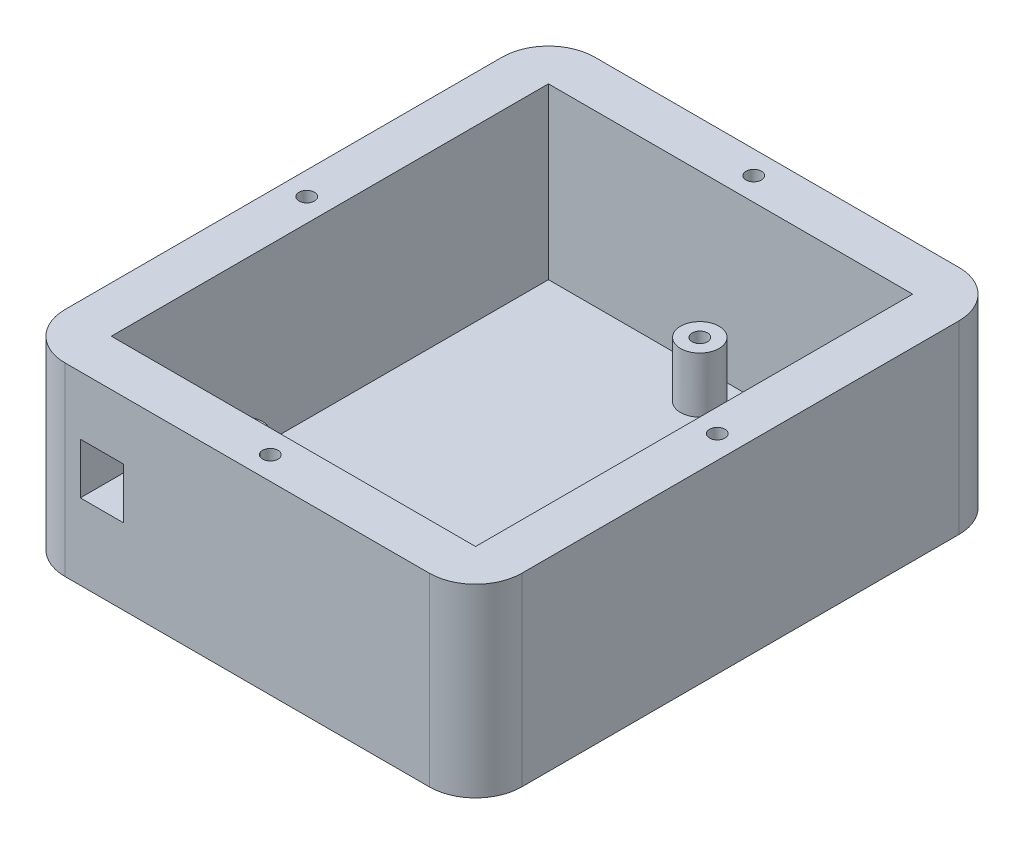
ISO-10303-21;
HEADER;
FILE_DESCRIPTION(('STEP AP214'),'2;1');
FILE_NAME('part.step','',(''),(''),'','','');
FILE_SCHEMA(('AUTOMOTIVE_DESIGN { 1 0 10303 214 1 1 1 1 }'));
ENDSEC;
DATA;
#1=APPLICATION_CONTEXT('core data for automotive mechanical design processes');
#2=APPLICATION_PROTOCOL_DEFINITION('international standard','automotive_design',2000,#1);
#3=PRODUCT_CONTEXT('',#1,'mechanical');
#4=PRODUCT('Part','Part','',(#3));
#5=PRODUCT_RELATED_PRODUCT_CATEGORY('part','',(#4));
#6=PRODUCT_DEFINITION_FORMATION('','',#4);
#7=PRODUCT_DEFINITION_CONTEXT('part definition',#1,'design');
#8=PRODUCT_DEFINITION('design','',#6,#7);
#9=PRODUCT_DEFINITION_SHAPE('','',#8);
#10=(LENGTH_UNIT() NAMED_UNIT(*) SI_UNIT(.MILLI.,.METRE.));
#11=(NAMED_UNIT(*) PLANE_ANGLE_UNIT() SI_UNIT($,.RADIAN.));
#12=(NAMED_UNIT(*) SI_UNIT($,.STERADIAN.) SOLID_ANGLE_UNIT());
#13=UNCERTAINTY_MEASURE_WITH_UNIT(LENGTH_MEASURE(1.E-05),#10,'distance_accuracy_value','');
#14=(GEOMETRIC_REPRESENTATION_CONTEXT(3) GLOBAL_UNCERTAINTY_ASSIGNED_CONTEXT((#13)) GLOBAL_UNIT_ASSIGNED_CONTEXT((#10,
#11,#12)) REPRESENTATION_CONTEXT('',''));
#15=CARTESIAN_POINT('',(0.,0.,0.));
#16=DIRECTION('',(0.,0.,1.));
#17=DIRECTION('',(1.,0.,0.));
#18=AXIS2_PLACEMENT_3D('',#15,#16,#17);
#19=CARTESIAN_POINT('',(3.175,38.1,-3.175));
#20=DIRECTION('',(0.,-1.,0.));
#21=DIRECTION('',(0.,0.,-1.));
#22=AXIS2_PLACEMENT_3D('',#19,#20,#21);
#23=PLANE('',#22);
#24=CARTESIAN_POINT('',(-1.5875,38.1,-48.175000043));
#25=DIRECTION('',(0.,1.,0.));
#26=DIRECTION('',(0.,0.,1.));
#27=AXIS2_PLACEMENT_3D('',#24,#25,#26);
#28=CIRCLE('',#27,1.5875);
#29=CARTESIAN_POINT('',(-1.5875,38.1,-46.587500043));
#30=VERTEX_POINT('',#29);
#31=EDGE_CURVE('E184',#30,#30,#28,.T.);
#32=ORIENTED_EDGE('',*,*,#31,.F.);
#33=EDGE_LOOP('',(#32));
#34=FACE_BOUND('',#33,.T.);
#35=CARTESIAN_POINT('',(40.675000057,38.1,-97.937500086));
#36=DIRECTION('',(0.,1.,0.));
#37=DIRECTION('',(0.,0.,1.));
#38=AXIS2_PLACEMENT_3D('',#35,#36,#37);
#39=CIRCLE('',#38,1.5875);
#40=CARTESIAN_POINT('',(40.675000057,38.1,-96.350000086));
#41=VERTEX_POINT('',#40);
#42=EDGE_CURVE('E190',#41,#41,#39,.T.);
#43=ORIENTED_EDGE('',*,*,#42,.F.);
#44=EDGE_LOOP('',(#43));
#45=FACE_BOUND('',#44,.T.);
#46=CARTESIAN_POINT('',(40.675000057,38.1,1.58749999999996));
#47=DIRECTION('',(0.,1.,0.));
#48=DIRECTION('',(0.,0.,-1.));
#49=AXIS2_PLACEMENT_3D('',#46,#47,#48);
#50=CIRCLE('',#49,1.5875);
#51=CARTESIAN_POINT('',(40.675000057,38.1,0.));
#52=VERTEX_POINT('',#51);
#53=EDGE_CURVE('E196',#52,#52,#50,.T.);
#54=ORIENTED_EDGE('',*,*,#53,.F.);
#55=EDGE_LOOP('',(#54));
#56=FACE_BOUND('',#55,.T.);
#57=CARTESIAN_POINT('',(82.937500114,38.1,-48.175000043));
#58=DIRECTION('',(0.,1.,0.));
#59=DIRECTION('',(0.,0.,-1.));
#60=AXIS2_PLACEMENT_3D('',#57,#58,#59);
#61=CIRCLE('',#60,1.58749999999999);
#62=CARTESIAN_POINT('',(82.937500114,38.1,-49.762500043));
#63=VERTEX_POINT('',#62);
#64=EDGE_CURVE('E178',#63,#63,#61,.T.);
#65=ORIENTED_EDGE('',*,*,#64,.F.);
#66=EDGE_LOOP('',(#65));
#67=FACE_BOUND('',#66,.T.);
#68=DIRECTION('',(0.,0.,-1.));
#69=VECTOR('',#68,1.);
#70=CARTESIAN_POINT('',(78.175000114,38.1,-3.175));
#71=LINE('',#70,#69);
#72=CARTESIAN_POINT('',(78.175000114,38.1,-3.175));
#73=VERTEX_POINT('',#72);
#74=CARTESIAN_POINT('',(78.175000114,38.1,-93.175000086));
#75=VERTEX_POINT('',#74);
#76=EDGE_CURVE('E281',#73,#75,#71,.T.);
#77=ORIENTED_EDGE('',*,*,#76,.F.);
#78=DIRECTION('',(1.,0.,0.));
#79=VECTOR('',#78,1.);
#80=CARTESIAN_POINT('',(3.175,38.1,-3.175));
#81=LINE('',#80,#79);
#82=CARTESIAN_POINT('',(3.175,38.1,-3.175));
#83=VERTEX_POINT('',#82);
#84=EDGE_CURVE('E284',#83,#73,#81,.T.);
#85=ORIENTED_EDGE('',*,*,#84,.F.);
#86=DIRECTION('',(0.,0.,1.));
#87=VECTOR('',#86,1.);
#88=CARTESIAN_POINT('',(3.175,38.1,-93.175000086));
#89=LINE('',#88,#87);
#90=CARTESIAN_POINT('',(3.175,38.1,-93.175000086));
#91=VERTEX_POINT('',#90);
#92=EDGE_CURVE('E277',#91,#83,#89,.T.);
#93=ORIENTED_EDGE('',*,*,#92,.F.);
#94=DIRECTION('',(-1.,0.,0.));
#95=VECTOR('',#94,1.);
#96=CARTESIAN_POINT('',(78.175000114,38.1,-93.175000086));
#97=LINE('',#96,#95);
#98=EDGE_CURVE('E278',#75,#91,#97,.T.);
#99=ORIENTED_EDGE('',*,*,#98,.F.);
#100=EDGE_LOOP('',(#77,#85,#93,#99));
#101=FACE_BOUND('',#100,.T.);
#102=CARTESIAN_POINT('',(3.175,38.1,-3.175));
#103=DIRECTION('',(0.,-1.,0.));
#104=DIRECTION('',(0.,0.,-1.));
#105=AXIS2_PLACEMENT_3D('',#102,#103,#104);
#106=CIRCLE('',#105,9.525);
#107=CARTESIAN_POINT('',(-6.35,38.1,-3.17500000000007));
#108=VERTEX_POINT('',#107);
#109=CARTESIAN_POINT('',(3.17500000000007,38.1,6.35));
#110=VERTEX_POINT('',#109);
#111=EDGE_CURVE('E207',#108,#110,#106,.F.);
#112=ORIENTED_EDGE('',*,*,#111,.T.);
#113=DIRECTION('',(1.,0.,0.));
#114=VECTOR('',#113,1.);
#115=CARTESIAN_POINT('',(78.175000114,38.1,6.35));
#116=LINE('',#115,#114);
#117=CARTESIAN_POINT('',(78.175000114,38.1,6.35));
#118=VERTEX_POINT('',#117);
#119=EDGE_CURVE('E219',#110,#118,#116,.T.);
#120=ORIENTED_EDGE('',*,*,#119,.T.);
#121=CARTESIAN_POINT('',(78.175000114,38.1,-3.175));
#122=DIRECTION('',(0.,-1.,0.));
#123=DIRECTION('',(0.,0.,-1.));
#124=AXIS2_PLACEMENT_3D('',#121,#122,#123);
#125=CIRCLE('',#124,9.525);
#126=CARTESIAN_POINT('',(87.700000114,38.1,-3.175));
#127=VERTEX_POINT('',#126);
#128=EDGE_CURVE('E217',#118,#127,#125,.F.);
#129=ORIENTED_EDGE('',*,*,#128,.T.);
#130=DIRECTION('',(0.,0.,-1.));
#131=VECTOR('',#130,1.);
#132=CARTESIAN_POINT('',(87.700000114,38.1,-93.175000086));
#133=LINE('',#132,#131);
#134=CARTESIAN_POINT('',(87.700000114,38.1,-93.175000086));
#135=VERTEX_POINT('',#134);
#136=EDGE_CURVE('E215',#127,#135,#133,.T.);
#137=ORIENTED_EDGE('',*,*,#136,.T.);
#138=CARTESIAN_POINT('',(78.175000114,38.1,-93.175000086));
#139=DIRECTION('',(0.,-1.,0.));
#140=DIRECTION('',(0.,0.,-1.));
#141=AXIS2_PLACEMENT_3D('',#138,#139,#140);
#142=CIRCLE('',#141,9.52499999999999);
#143=CARTESIAN_POINT('',(78.175000114,38.1,-102.700000086));
#144=VERTEX_POINT('',#143);
#145=EDGE_CURVE('E213',#135,#144,#142,.F.);
#146=ORIENTED_EDGE('',*,*,#145,.T.);
#147=DIRECTION('',(-1.,0.,0.));
#148=VECTOR('',#147,1.);
#149=CARTESIAN_POINT('',(3.17500000000007,38.1,-102.700000086));
#150=LINE('',#149,#148);
#151=CARTESIAN_POINT('',(3.175,38.1,-102.700000086));
#152=VERTEX_POINT('',#151);
#153=EDGE_CURVE('E210',#144,#152,#150,.T.);
#154=ORIENTED_EDGE('',*,*,#153,.T.);
#155=CARTESIAN_POINT('',(3.175,38.1,-93.175000086));
#156=DIRECTION('',(0.,-1.,0.));
#157=DIRECTION('',(0.,0.,-1.));
#158=AXIS2_PLACEMENT_3D('',#155,#156,#157);
#159=CIRCLE('',#158,9.525);
#160=CARTESIAN_POINT('',(-6.35,38.1,-93.175000086));
#161=VERTEX_POINT('',#160);
#162=EDGE_CURVE('E208',#152,#161,#159,.F.);
#163=ORIENTED_EDGE('',*,*,#162,.T.);
#164=DIRECTION('',(0.,0.,1.));
#165=VECTOR('',#164,1.);
#166=CARTESIAN_POINT('',(-6.35,38.1,-3.17500000000007));
#167=LINE('',#166,#165);
#168=EDGE_CURVE('E204',#161,#108,#167,.T.);
#169=ORIENTED_EDGE('',*,*,#168,.T.);
#170=EDGE_LOOP('',(#112,#120,#129,#137,#146,#154,#163,#169));
#171=FACE_BOUND('',#170,.T.);
#172=ADVANCED_FACE('F35',(#34,#45,#56,#67,#101,#171),#23,.F.);
#173=CARTESIAN_POINT('',(3.175,3.175,-3.175));
#174=DIRECTION('',(0.,-1.,0.));
#175=DIRECTION('',(0.,0.,-1.));
#176=AXIS2_PLACEMENT_3D('',#173,#174,#175);
#177=PLANE('',#176);
#178=CARTESIAN_POINT('',(10.465000057,3.175,-23.050000043));
#179=DIRECTION('',(0.,-1.,0.));
#180=DIRECTION('',(0.,0.,-1.));
#181=AXIS2_PLACEMENT_3D('',#178,#179,#180);
#182=CIRCLE('',#181,3.96875);
#183=CARTESIAN_POINT('',(10.465000057,3.175,-27.018750043));
#184=VERTEX_POINT('',#183);
#185=EDGE_CURVE('E12',#184,#184,#182,.F.);
#186=ORIENTED_EDGE('',*,*,#185,.F.);
#187=EDGE_LOOP('',(#186));
#188=FACE_BOUND('',#187,.T.);
#189=CARTESIAN_POINT('',(40.465000057,3.175,-87.050000043));
#190=DIRECTION('',(0.,-1.,0.));
#191=DIRECTION('',(0.,0.,-1.));
#192=AXIS2_PLACEMENT_3D('',#189,#190,#191);
#193=CIRCLE('',#192,3.96874999999998);
#194=CARTESIAN_POINT('',(40.465000057,3.175,-91.018750043));
#195=VERTEX_POINT('',#194);
#196=EDGE_CURVE('E43',#195,#195,#193,.F.);
#197=ORIENTED_EDGE('',*,*,#196,.F.);
#198=EDGE_LOOP('',(#197));
#199=FACE_BOUND('',#198,.T.);
#200=DIRECTION('',(0.,0.,1.));
#201=VECTOR('',#200,1.);
#202=CARTESIAN_POINT('',(3.175,3.175,-93.175000086));
#203=LINE('',#202,#201);
#204=CARTESIAN_POINT('',(3.175,3.175,-93.175000086));
#205=VERTEX_POINT('',#204);
#206=CARTESIAN_POINT('',(3.175,3.175,-3.175));
#207=VERTEX_POINT('',#206);
#208=EDGE_CURVE('E292',#205,#207,#203,.T.);
#209=ORIENTED_EDGE('',*,*,#208,.T.);
#210=DIRECTION('',(1.,0.,0.));
#211=VECTOR('',#210,1.);
#212=CARTESIAN_POINT('',(3.175,3.175,-3.175));
#213=LINE('',#212,#211);
#214=CARTESIAN_POINT('',(78.175000114,3.175,-3.175));
#215=VERTEX_POINT('',#214);
#216=EDGE_CURVE('E280',#207,#215,#213,.T.);
#217=ORIENTED_EDGE('',*,*,#216,.T.);
#218=DIRECTION('',(0.,0.,-1.));
#219=VECTOR('',#218,1.);
#220=CARTESIAN_POINT('',(78.175000114,3.175,-3.175));
#221=LINE('',#220,#219);
#222=CARTESIAN_POINT('',(78.175000114,3.175,-93.175000086));
#223=VERTEX_POINT('',#222);
#224=EDGE_CURVE('E301',#215,#223,#221,.T.);
#225=ORIENTED_EDGE('',*,*,#224,.T.);
#226=DIRECTION('',(-1.,0.,0.));
#227=VECTOR('',#226,1.);
#228=CARTESIAN_POINT('',(78.175000114,3.175,-93.175000086));
#229=LINE('',#228,#227);
#230=EDGE_CURVE('E297',#223,#205,#229,.T.);
#231=ORIENTED_EDGE('',*,*,#230,.T.);
#232=EDGE_LOOP('',(#209,#217,#225,#231));
#233=FACE_BOUND('',#232,.T.);
#234=ADVANCED_FACE('F313',(#188,#199,#233),#177,.F.);
#235=CARTESIAN_POINT('',(3.175,-117.153745277648,-3.175));
#236=DIRECTION('',(0.,0.,1.));
#237=DIRECTION('',(1.,0.,0.));
#238=AXIS2_PLACEMENT_3D('',#235,#236,#237);
#239=PLANE('',#238);
#240=DIRECTION('',(1.,0.,0.));
#241=VECTOR('',#240,1.);
#242=CARTESIAN_POINT('',(6.32000005699999,26.0825,-3.175));
#243=LINE('',#242,#241);
#244=CARTESIAN_POINT('',(6.32000005699999,26.0825,-3.175));
#245=VERTEX_POINT('',#244);
#246=CARTESIAN_POINT('',(15.210000057,26.0825,-3.175));
#247=VERTEX_POINT('',#246);
#248=EDGE_CURVE('E426',#245,#247,#243,.T.);
#249=ORIENTED_EDGE('',*,*,#248,.F.);
#250=DIRECTION('',(0.,1.,0.));
#251=VECTOR('',#250,1.);
#252=CARTESIAN_POINT('',(6.32000005699999,26.0825,-3.175));
#253=LINE('',#252,#251);
#254=CARTESIAN_POINT('',(6.320000057,15.605,-3.175));
#255=VERTEX_POINT('',#254);
#256=EDGE_CURVE('E179',#255,#245,#253,.T.);
#257=ORIENTED_EDGE('',*,*,#256,.F.);
#258=DIRECTION('',(-1.,0.,0.));
#259=VECTOR('',#258,1.);
#260=CARTESIAN_POINT('',(6.320000057,15.605,-3.175));
#261=LINE('',#260,#259);
#262=CARTESIAN_POINT('',(15.210000057,15.605,-3.175));
#263=VERTEX_POINT('',#262);
#264=EDGE_CURVE('E176',#263,#255,#261,.T.);
#265=ORIENTED_EDGE('',*,*,#264,.F.);
#266=DIRECTION('',(0.,-1.,0.));
#267=VECTOR('',#266,1.);
#268=CARTESIAN_POINT('',(15.210000057,26.0825,-3.175));
#269=LINE('',#268,#267);
#270=EDGE_CURVE('E154',#247,#263,#269,.T.);
#271=ORIENTED_EDGE('',*,*,#270,.F.);
#272=EDGE_LOOP('',(#249,#257,#265,#271));
#273=FACE_BOUND('',#272,.T.);
#274=DIRECTION('',(0.,1.,0.));
#275=VECTOR('',#274,1.);
#276=CARTESIAN_POINT('',(3.175,-117.153745277648,-3.175));
#277=LINE('',#276,#275);
#278=EDGE_CURVE('E295',#207,#83,#277,.T.);
#279=ORIENTED_EDGE('',*,*,#278,.T.);
#280=ORIENTED_EDGE('',*,*,#84,.T.);
#281=DIRECTION('',(0.,1.,0.));
#282=VECTOR('',#281,1.);
#283=CARTESIAN_POINT('',(78.175000114,-117.153745277648,-3.175));
#284=LINE('',#283,#282);
#285=EDGE_CURVE('E291',#215,#73,#284,.T.);
#286=ORIENTED_EDGE('',*,*,#285,.F.);
#287=ORIENTED_EDGE('',*,*,#216,.F.);
#288=EDGE_LOOP('',(#279,#280,#286,#287));
#289=FACE_BOUND('',#288,.T.);
#290=ADVANCED_FACE('F316',(#273,#289),#239,.F.);
#291=CARTESIAN_POINT('',(78.175000114,-117.153745277648,-3.175));
#292=DIRECTION('',(1.,0.,0.));
#293=DIRECTION('',(0.,0.,-1.));
#294=AXIS2_PLACEMENT_3D('',#291,#292,#293);
#295=PLANE('',#294);
#296=ORIENTED_EDGE('',*,*,#285,.T.);
#297=ORIENTED_EDGE('',*,*,#76,.T.);
#298=DIRECTION('',(0.,1.,0.));
#299=VECTOR('',#298,1.);
#300=CARTESIAN_POINT('',(78.175000114,-117.153745277648,-93.175000086));
#301=LINE('',#300,#299);
#302=EDGE_CURVE('E300',#223,#75,#301,.T.);
#303=ORIENTED_EDGE('',*,*,#302,.F.);
#304=ORIENTED_EDGE('',*,*,#224,.F.);
#305=EDGE_LOOP('',(#296,#297,#303,#304));
#306=FACE_BOUND('',#305,.T.);
#307=ADVANCED_FACE('F331',(#306),#295,.F.);
#308=CARTESIAN_POINT('',(78.175000114,-117.153745277648,-93.175000086));
#309=DIRECTION('',(0.,0.,-1.));
#310=DIRECTION('',(-1.,0.,0.));
#311=AXIS2_PLACEMENT_3D('',#308,#309,#310);
#312=PLANE('',#311);
#313=ORIENTED_EDGE('',*,*,#302,.T.);
#314=ORIENTED_EDGE('',*,*,#98,.T.);
#315=DIRECTION('',(0.,1.,0.));
#316=VECTOR('',#315,1.);
#317=CARTESIAN_POINT('',(3.175,-117.153745277648,-93.175000086));
#318=LINE('',#317,#316);
#319=EDGE_CURVE('E296',#205,#91,#318,.T.);
#320=ORIENTED_EDGE('',*,*,#319,.F.);
#321=ORIENTED_EDGE('',*,*,#230,.F.);
#322=EDGE_LOOP('',(#313,#314,#320,#321));
#323=FACE_BOUND('',#322,.T.);
#324=ADVANCED_FACE('F335',(#323),#312,.F.);
#325=CARTESIAN_POINT('',(3.175,-117.153745277648,-93.175000086));
#326=DIRECTION('',(-1.,0.,0.));
#327=DIRECTION('',(0.,0.,1.));
#328=AXIS2_PLACEMENT_3D('',#325,#326,#327);
#329=PLANE('',#328);
#330=ORIENTED_EDGE('',*,*,#319,.T.);
#331=ORIENTED_EDGE('',*,*,#92,.T.);
#332=ORIENTED_EDGE('',*,*,#278,.F.);
#333=ORIENTED_EDGE('',*,*,#208,.F.);
#334=EDGE_LOOP('',(#330,#331,#332,#333));
#335=FACE_BOUND('',#334,.T.);
#336=ADVANCED_FACE('F324',(#335),#329,.F.);
#337=CARTESIAN_POINT('',(40.465000057,14.605,-87.050000043));
#338=DIRECTION('',(0.,1.,0.));
#339=DIRECTION('',(0.,0.,1.));
#340=AXIS2_PLACEMENT_3D('',#337,#338,#339);
#341=PLANE('',#340);
#342=CARTESIAN_POINT('',(40.465000057,14.605,-87.050000043));
#343=DIRECTION('',(0.,1.,0.));
#344=DIRECTION('',(0.,0.,1.));
#345=AXIS2_PLACEMENT_3D('',#342,#343,#344);
#346=CIRCLE('',#345,3.96874999999998);
#347=CARTESIAN_POINT('',(40.465000057,14.605,-83.081250043));
#348=VERTEX_POINT('',#347);
#349=EDGE_CURVE('E272',#348,#348,#346,.T.);
#350=ORIENTED_EDGE('',*,*,#349,.T.);
#351=EDGE_LOOP('',(#350));
#352=FACE_BOUND('',#351,.T.);
#353=CARTESIAN_POINT('',(40.465000057,14.605,-87.050000043));
#354=DIRECTION('',(0.,1.,0.));
#355=DIRECTION('',(0.,0.,1.));
#356=AXIS2_PLACEMENT_3D('',#353,#354,#355);
#357=CIRCLE('',#356,1.5875);
#358=CARTESIAN_POINT('',(40.465000057,14.605,-85.462500043));
#359=VERTEX_POINT('',#358);
#360=EDGE_CURVE('E269',#359,#359,#357,.T.);
#361=ORIENTED_EDGE('',*,*,#360,.F.);
#362=EDGE_LOOP('',(#361));
#363=FACE_BOUND('',#362,.T.);
#364=ADVANCED_FACE('F407',(#352,#363),#341,.T.);
#365=CARTESIAN_POINT('',(40.465000057,14.605,-87.050000043));
#366=DIRECTION('',(0.,-1.,0.));
#367=DIRECTION('',(0.,0.,-1.));
#368=AXIS2_PLACEMENT_3D('',#365,#366,#367);
#369=CYLINDRICAL_SURFACE('',#368,3.96874999999998);
#370=ORIENTED_EDGE('',*,*,#349,.F.);
#371=EDGE_LOOP('',(#370));
#372=FACE_BOUND('',#371,.T.);
#373=ORIENTED_EDGE('',*,*,#196,.T.);
#374=EDGE_LOOP('',(#373));
#375=FACE_BOUND('',#374,.T.);
#376=ADVANCED_FACE('F311',(#372,#375),#369,.T.);
#377=CARTESIAN_POINT('',(40.465000057,14.605,-87.050000043));
#378=DIRECTION('',(0.,-1.,0.));
#379=DIRECTION('',(0.,0.,-1.));
#380=AXIS2_PLACEMENT_3D('',#377,#378,#379);
#381=CYLINDRICAL_SURFACE('',#380,1.5875);
#382=ORIENTED_EDGE('',*,*,#360,.T.);
#383=EDGE_LOOP('',(#382));
#384=FACE_BOUND('',#383,.T.);
#385=CARTESIAN_POINT('',(40.465000057,3.175,-87.050000043));
#386=DIRECTION('',(0.,1.,0.));
#387=DIRECTION('',(0.,0.,1.));
#388=AXIS2_PLACEMENT_3D('',#385,#386,#387);
#389=CIRCLE('',#388,1.5875);
#390=CARTESIAN_POINT('',(40.465000057,3.175,-85.462500043));
#391=VERTEX_POINT('',#390);
#392=EDGE_CURVE('E268',#391,#391,#389,.T.);
#393=ORIENTED_EDGE('',*,*,#392,.F.);
#394=EDGE_LOOP('',(#393));
#395=FACE_BOUND('',#394,.T.);
#396=ADVANCED_FACE('F403',(#384,#395),#381,.F.);
#397=ORIENTED_EDGE('',*,*,#392,.T.);
#398=EDGE_LOOP('',(#397));
#399=FACE_BOUND('',#398,.T.);
#400=ADVANCED_FACE('F320',(#399),#177,.F.);
#401=CARTESIAN_POINT('',(10.465000057,14.605,-23.050000043));
#402=DIRECTION('',(0.,1.,0.));
#403=DIRECTION('',(0.,0.,1.));
#404=AXIS2_PLACEMENT_3D('',#401,#402,#403);
#405=PLANE('',#404);
#406=CARTESIAN_POINT('',(10.465000057,14.605,-23.050000043));
#407=DIRECTION('',(0.,1.,0.));
#408=DIRECTION('',(0.,0.,1.));
#409=AXIS2_PLACEMENT_3D('',#406,#407,#408);
#410=CIRCLE('',#409,3.96875);
#411=CARTESIAN_POINT('',(10.465000057,14.605,-19.081250043));
#412=VERTEX_POINT('',#411);
#413=EDGE_CURVE('E263',#412,#412,#410,.T.);
#414=ORIENTED_EDGE('',*,*,#413,.T.);
#415=EDGE_LOOP('',(#414));
#416=FACE_BOUND('',#415,.T.);
#417=CARTESIAN_POINT('',(10.465000057,14.605,-23.050000043));
#418=DIRECTION('',(0.,1.,0.));
#419=DIRECTION('',(0.,0.,1.));
#420=AXIS2_PLACEMENT_3D('',#417,#418,#419);
#421=CIRCLE('',#420,1.5875);
#422=CARTESIAN_POINT('',(10.465000057,14.605,-21.462500043));
#423=VERTEX_POINT('',#422);
#424=EDGE_CURVE('E260',#423,#423,#421,.T.);
#425=ORIENTED_EDGE('',*,*,#424,.F.);
#426=EDGE_LOOP('',(#425));
#427=FACE_BOUND('',#426,.T.);
#428=ADVANCED_FACE('F396',(#416,#427),#405,.T.);
#429=CARTESIAN_POINT('',(10.465000057,14.605,-23.050000043));
#430=DIRECTION('',(0.,-1.,0.));
#431=DIRECTION('',(0.,0.,-1.));
#432=AXIS2_PLACEMENT_3D('',#429,#430,#431);
#433=CYLINDRICAL_SURFACE('',#432,3.96875);
#434=ORIENTED_EDGE('',*,*,#413,.F.);
#435=EDGE_LOOP('',(#434));
#436=FACE_BOUND('',#435,.T.);
#437=ORIENTED_EDGE('',*,*,#185,.T.);
#438=EDGE_LOOP('',(#437));
#439=FACE_BOUND('',#438,.T.);
#440=ADVANCED_FACE('F394',(#436,#439),#433,.T.);
#441=CARTESIAN_POINT('',(10.465000057,14.605,-23.050000043));
#442=DIRECTION('',(0.,-1.,0.));
#443=DIRECTION('',(0.,0.,-1.));
#444=AXIS2_PLACEMENT_3D('',#441,#442,#443);
#445=CYLINDRICAL_SURFACE('',#444,1.5875);
#446=ORIENTED_EDGE('',*,*,#424,.T.);
#447=EDGE_LOOP('',(#446));
#448=FACE_BOUND('',#447,.T.);
#449=CARTESIAN_POINT('',(10.465000057,3.175,-23.050000043));
#450=DIRECTION('',(0.,1.,0.));
#451=DIRECTION('',(0.,0.,1.));
#452=AXIS2_PLACEMENT_3D('',#449,#450,#451);
#453=CIRCLE('',#452,1.5875);
#454=CARTESIAN_POINT('',(10.465000057,3.175,-21.462500043));
#455=VERTEX_POINT('',#454);
#456=EDGE_CURVE('E206',#455,#455,#453,.T.);
#457=ORIENTED_EDGE('',*,*,#456,.F.);
#458=EDGE_LOOP('',(#457));
#459=FACE_BOUND('',#458,.T.);
#460=ADVANCED_FACE('F386',(#448,#459),#445,.F.);
#461=ORIENTED_EDGE('',*,*,#456,.T.);
#462=EDGE_LOOP('',(#461));
#463=FACE_BOUND('',#462,.T.);
#464=ADVANCED_FACE('F319',(#463),#177,.F.);
#465=CARTESIAN_POINT('',(-6.35,182.104531318289,-3.17500000000007));
#466=DIRECTION('',(-1.,0.,0.));
#467=DIRECTION('',(0.,0.,1.));
#468=AXIS2_PLACEMENT_3D('',#465,#466,#467);
#469=PLANE('',#468);
#470=ORIENTED_EDGE('',*,*,#168,.F.);
#471=DIRECTION('',(0.,-1.,0.));
#472=VECTOR('',#471,1.);
#473=CARTESIAN_POINT('',(-6.35,182.104531318289,-93.175000086));
#474=LINE('',#473,#472);
#475=CARTESIAN_POINT('',(-6.35,0.,-93.175000086));
#476=VERTEX_POINT('',#475);
#477=EDGE_CURVE('E257',#161,#476,#474,.T.);
#478=ORIENTED_EDGE('',*,*,#477,.T.);
#479=DIRECTION('',(0.,0.,-1.));
#480=VECTOR('',#479,1.);
#481=CARTESIAN_POINT('',(-6.35,0.,-3.17500000000007));
#482=LINE('',#481,#480);
#483=CARTESIAN_POINT('',(-6.35,0.,-3.17500000000007));
#484=VERTEX_POINT('',#483);
#485=EDGE_CURVE('E224',#484,#476,#482,.T.);
#486=ORIENTED_EDGE('',*,*,#485,.F.);
#487=DIRECTION('',(0.,-1.,0.));
#488=VECTOR('',#487,1.);
#489=CARTESIAN_POINT('',(-6.35,182.104531318289,-3.17500000000007));
#490=LINE('',#489,#488);
#491=EDGE_CURVE('E245',#108,#484,#490,.T.);
#492=ORIENTED_EDGE('',*,*,#491,.F.);
#493=EDGE_LOOP('',(#470,#478,#486,#492));
#494=FACE_BOUND('',#493,.T.);
#495=ADVANCED_FACE('F378',(#494),#469,.T.);
#496=CARTESIAN_POINT('',(3.175,182.104531318289,-93.175000086));
#497=DIRECTION('',(0.,-1.,0.));
#498=DIRECTION('',(0.,0.,-1.));
#499=AXIS2_PLACEMENT_3D('',#496,#497,#498);
#500=CYLINDRICAL_SURFACE('',#499,9.525);
#501=ORIENTED_EDGE('',*,*,#162,.F.);
#502=DIRECTION('',(0.,-1.,0.));
#503=VECTOR('',#502,1.);
#504=CARTESIAN_POINT('',(3.17500000000007,182.104531318289,-102.700000086));
#505=LINE('',#504,#503);
#506=CARTESIAN_POINT('',(3.17500000000007,0.,-102.700000086));
#507=VERTEX_POINT('',#506);
#508=EDGE_CURVE('E255',#152,#507,#505,.T.);
#509=ORIENTED_EDGE('',*,*,#508,.T.);
#510=CARTESIAN_POINT('',(3.175,0.,-93.175000086));
#511=DIRECTION('',(0.,-1.,0.));
#512=DIRECTION('',(0.,0.,-1.));
#513=AXIS2_PLACEMENT_3D('',#510,#511,#512);
#514=CIRCLE('',#513,9.525);
#515=EDGE_CURVE('E227',#476,#507,#514,.T.);
#516=ORIENTED_EDGE('',*,*,#515,.F.);
#517=ORIENTED_EDGE('',*,*,#477,.F.);
#518=EDGE_LOOP('',(#501,#509,#516,#517));
#519=FACE_BOUND('',#518,.T.);
#520=ADVANCED_FACE('F375',(#519),#500,.T.);
#521=CARTESIAN_POINT('',(3.17500000000007,182.104531318289,-102.700000086));
#522=DIRECTION('',(0.,0.,-1.));
#523=DIRECTION('',(-1.,0.,0.));
#524=AXIS2_PLACEMENT_3D('',#521,#522,#523);
#525=PLANE('',#524);
#526=ORIENTED_EDGE('',*,*,#153,.F.);
#527=DIRECTION('',(0.,-1.,0.));
#528=VECTOR('',#527,1.);
#529=CARTESIAN_POINT('',(78.175000114,182.104531318289,-102.700000086));
#530=LINE('',#529,#528);
#531=CARTESIAN_POINT('',(78.175000114,0.,-102.700000086));
#532=VERTEX_POINT('',#531);
#533=EDGE_CURVE('E253',#144,#532,#530,.T.);
#534=ORIENTED_EDGE('',*,*,#533,.T.);
#535=DIRECTION('',(1.,0.,0.));
#536=VECTOR('',#535,1.);
#537=CARTESIAN_POINT('',(3.17500000000007,0.,-102.700000086));
#538=LINE('',#537,#536);
#539=EDGE_CURVE('E230',#507,#532,#538,.T.);
#540=ORIENTED_EDGE('',*,*,#539,.F.);
#541=ORIENTED_EDGE('',*,*,#508,.F.);
#542=EDGE_LOOP('',(#526,#534,#540,#541));
#543=FACE_BOUND('',#542,.T.);
#544=ADVANCED_FACE('F371',(#543),#525,.T.);
#545=CARTESIAN_POINT('',(78.175000114,182.104531318289,-93.175000086));
#546=DIRECTION('',(0.,-1.,0.));
#547=DIRECTION('',(0.,0.,-1.));
#548=AXIS2_PLACEMENT_3D('',#545,#546,#547);
#549=CYLINDRICAL_SURFACE('',#548,9.52499999999999);
#550=ORIENTED_EDGE('',*,*,#145,.F.);
#551=DIRECTION('',(0.,-1.,0.));
#552=VECTOR('',#551,1.);
#553=CARTESIAN_POINT('',(87.700000114,182.104531318289,-93.175000086));
#554=LINE('',#553,#552);
#555=CARTESIAN_POINT('',(87.700000114,0.,-93.175000086));
#556=VERTEX_POINT('',#555);
#557=EDGE_CURVE('E251',#135,#556,#554,.T.);
#558=ORIENTED_EDGE('',*,*,#557,.T.);
#559=CARTESIAN_POINT('',(78.175000114,0.,-93.175000086));
#560=DIRECTION('',(0.,-1.,0.));
#561=DIRECTION('',(0.,0.,-1.));
#562=AXIS2_PLACEMENT_3D('',#559,#560,#561);
#563=CIRCLE('',#562,9.52499999999999);
#564=EDGE_CURVE('E233',#532,#556,#563,.T.);
#565=ORIENTED_EDGE('',*,*,#564,.F.);
#566=ORIENTED_EDGE('',*,*,#533,.F.);
#567=EDGE_LOOP('',(#550,#558,#565,#566));
#568=FACE_BOUND('',#567,.T.);
#569=ADVANCED_FACE('F365',(#568),#549,.T.);
#570=CARTESIAN_POINT('',(87.700000114,182.104531318289,-93.175000086));
#571=DIRECTION('',(1.,0.,0.));
#572=DIRECTION('',(0.,0.,-1.));
#573=AXIS2_PLACEMENT_3D('',#570,#571,#572);
#574=PLANE('',#573);
#575=ORIENTED_EDGE('',*,*,#136,.F.);
#576=DIRECTION('',(0.,-1.,0.));
#577=VECTOR('',#576,1.);
#578=CARTESIAN_POINT('',(87.700000114,182.104531318289,-3.175));
#579=LINE('',#578,#577);
#580=CARTESIAN_POINT('',(87.700000114,0.,-3.175));
#581=VERTEX_POINT('',#580);
#582=EDGE_CURVE('E249',#127,#581,#579,.T.);
#583=ORIENTED_EDGE('',*,*,#582,.T.);
#584=DIRECTION('',(0.,0.,1.));
#585=VECTOR('',#584,1.);
#586=CARTESIAN_POINT('',(87.700000114,0.,-93.175000086));
#587=LINE('',#586,#585);
#588=EDGE_CURVE('E236',#556,#581,#587,.T.);
#589=ORIENTED_EDGE('',*,*,#588,.F.);
#590=ORIENTED_EDGE('',*,*,#557,.F.);
#591=EDGE_LOOP('',(#575,#583,#589,#590));
#592=FACE_BOUND('',#591,.T.);
#593=ADVANCED_FACE('F362',(#592),#574,.T.);
#594=CARTESIAN_POINT('',(78.175000114,182.104531318289,-3.175));
#595=DIRECTION('',(0.,-1.,0.));
#596=DIRECTION('',(0.,0.,-1.));
#597=AXIS2_PLACEMENT_3D('',#594,#595,#596);
#598=CYLINDRICAL_SURFACE('',#597,9.525);
#599=ORIENTED_EDGE('',*,*,#128,.F.);
#600=DIRECTION('',(0.,-1.,0.));
#601=VECTOR('',#600,1.);
#602=CARTESIAN_POINT('',(78.175000114,182.104531318289,6.35));
#603=LINE('',#602,#601);
#604=CARTESIAN_POINT('',(78.175000114,0.,6.35));
#605=VERTEX_POINT('',#604);
#606=EDGE_CURVE('E247',#118,#605,#603,.T.);
#607=ORIENTED_EDGE('',*,*,#606,.T.);
#608=CARTESIAN_POINT('',(78.175000114,0.,-3.175));
#609=DIRECTION('',(0.,-1.,0.));
#610=DIRECTION('',(0.,0.,-1.));
#611=AXIS2_PLACEMENT_3D('',#608,#609,#610);
#612=CIRCLE('',#611,9.525);
#613=EDGE_CURVE('E239',#581,#605,#612,.T.);
#614=ORIENTED_EDGE('',*,*,#613,.F.);
#615=ORIENTED_EDGE('',*,*,#582,.F.);
#616=EDGE_LOOP('',(#599,#607,#614,#615));
#617=FACE_BOUND('',#616,.T.);
#618=ADVANCED_FACE('F357',(#617),#598,.T.);
#619=CARTESIAN_POINT('',(78.175000114,182.104531318289,6.35));
#620=DIRECTION('',(0.,0.,1.));
#621=DIRECTION('',(1.,0.,0.));
#622=AXIS2_PLACEMENT_3D('',#619,#620,#621);
#623=PLANE('',#622);
#624=DIRECTION('',(0.,-1.,0.));
#625=VECTOR('',#624,1.);
#626=CARTESIAN_POINT('',(6.32000005699999,26.0825,6.35));
#627=LINE('',#626,#625);
#628=CARTESIAN_POINT('',(6.32000005699999,26.0825,6.35));
#629=VERTEX_POINT('',#628);
#630=CARTESIAN_POINT('',(6.32000005699999,15.605,6.35));
#631=VERTEX_POINT('',#630);
#632=EDGE_CURVE('E58',#629,#631,#627,.T.);
#633=ORIENTED_EDGE('',*,*,#632,.F.);
#634=DIRECTION('',(-1.,0.,0.));
#635=VECTOR('',#634,1.);
#636=CARTESIAN_POINT('',(6.32000005699999,26.0825,6.35));
#637=LINE('',#636,#635);
#638=CARTESIAN_POINT('',(15.210000057,26.0825,6.35));
#639=VERTEX_POINT('',#638);
#640=EDGE_CURVE('E167',#639,#629,#637,.T.);
#641=ORIENTED_EDGE('',*,*,#640,.F.);
#642=DIRECTION('',(0.,1.,0.));
#643=VECTOR('',#642,1.);
#644=CARTESIAN_POINT('',(15.210000057,26.0825,6.35));
#645=LINE('',#644,#643);
#646=CARTESIAN_POINT('',(15.210000057,15.605,6.35));
#647=VERTEX_POINT('',#646);
#648=EDGE_CURVE('E151',#647,#639,#645,.T.);
#649=ORIENTED_EDGE('',*,*,#648,.F.);
#650=DIRECTION('',(1.,0.,0.));
#651=VECTOR('',#650,1.);
#652=CARTESIAN_POINT('',(6.320000057,15.605,6.35));
#653=LINE('',#652,#651);
#654=EDGE_CURVE('E160',#631,#647,#653,.T.);
#655=ORIENTED_EDGE('',*,*,#654,.F.);
#656=EDGE_LOOP('',(#633,#641,#649,#655));
#657=FACE_BOUND('',#656,.T.);
#658=ORIENTED_EDGE('',*,*,#119,.F.);
#659=DIRECTION('',(0.,-1.,0.));
#660=VECTOR('',#659,1.);
#661=CARTESIAN_POINT('',(3.17500000000007,182.104531318289,6.35));
#662=LINE('',#661,#660);
#663=CARTESIAN_POINT('',(3.17500000000007,0.,6.35));
#664=VERTEX_POINT('',#663);
#665=EDGE_CURVE('E211',#110,#664,#662,.T.);
#666=ORIENTED_EDGE('',*,*,#665,.T.);
#667=DIRECTION('',(-1.,0.,0.));
#668=VECTOR('',#667,1.);
#669=CARTESIAN_POINT('',(78.175000114,0.,6.35));
#670=LINE('',#669,#668);
#671=EDGE_CURVE('E242',#605,#664,#670,.T.);
#672=ORIENTED_EDGE('',*,*,#671,.F.);
#673=ORIENTED_EDGE('',*,*,#606,.F.);
#674=EDGE_LOOP('',(#658,#666,#672,#673));
#675=FACE_BOUND('',#674,.T.);
#676=ADVANCED_FACE('F164',(#657,#675),#623,.T.);
#677=CARTESIAN_POINT('',(3.175,182.104531318289,-3.175));
#678=DIRECTION('',(0.,-1.,0.));
#679=DIRECTION('',(0.,0.,-1.));
#680=AXIS2_PLACEMENT_3D('',#677,#678,#679);
#681=CYLINDRICAL_SURFACE('',#680,9.525);
#682=ORIENTED_EDGE('',*,*,#111,.F.);
#683=ORIENTED_EDGE('',*,*,#491,.T.);
#684=CARTESIAN_POINT('',(3.175,0.,-3.175));
#685=DIRECTION('',(0.,-1.,0.));
#686=DIRECTION('',(0.,0.,-1.));
#687=AXIS2_PLACEMENT_3D('',#684,#685,#686);
#688=CIRCLE('',#687,9.525);
#689=EDGE_CURVE('E183',#664,#484,#688,.T.);
#690=ORIENTED_EDGE('',*,*,#689,.F.);
#691=ORIENTED_EDGE('',*,*,#665,.F.);
#692=EDGE_LOOP('',(#682,#683,#690,#691));
#693=FACE_BOUND('',#692,.T.);
#694=ADVANCED_FACE('F350',(#693),#681,.T.);
#695=CARTESIAN_POINT('',(3.175,0.,-3.175));
#696=DIRECTION('',(0.,-1.,0.));
#697=DIRECTION('',(0.,0.,-1.));
#698=AXIS2_PLACEMENT_3D('',#695,#696,#697);
#699=PLANE('',#698);
#700=ORIENTED_EDGE('',*,*,#689,.T.);
#701=ORIENTED_EDGE('',*,*,#485,.T.);
#702=ORIENTED_EDGE('',*,*,#515,.T.);
#703=ORIENTED_EDGE('',*,*,#539,.T.);
#704=ORIENTED_EDGE('',*,*,#564,.T.);
#705=ORIENTED_EDGE('',*,*,#588,.T.);
#706=ORIENTED_EDGE('',*,*,#613,.T.);
#707=ORIENTED_EDGE('',*,*,#671,.T.);
#708=EDGE_LOOP('',(#700,#701,#702,#703,#704,#705,#706,#707));
#709=FACE_BOUND('',#708,.T.);
#710=ADVANCED_FACE('F37',(#709),#699,.T.);
#711=CARTESIAN_POINT('',(82.937500114,25.4,-48.175000043));
#712=DIRECTION('',(0.,1.,0.));
#713=DIRECTION('',(0.,0.,1.));
#714=AXIS2_PLACEMENT_3D('',#711,#712,#713);
#715=CYLINDRICAL_SURFACE('',#714,1.58749999999999);
#716=CARTESIAN_POINT('',(82.937500114,25.4,-48.175000043));
#717=DIRECTION('',(0.,1.,0.));
#718=DIRECTION('',(0.,0.,-1.));
#719=AXIS2_PLACEMENT_3D('',#716,#717,#718);
#720=CIRCLE('',#719,1.58749999999999);
#721=CARTESIAN_POINT('',(82.937500114,25.4,-49.762500043));
#722=VERTEX_POINT('',#721);
#723=EDGE_CURVE('E199',#722,#722,#720,.T.);
#724=ORIENTED_EDGE('',*,*,#723,.F.);
#725=EDGE_LOOP('',(#724));
#726=FACE_BOUND('',#725,.T.);
#727=ORIENTED_EDGE('',*,*,#64,.T.);
#728=EDGE_LOOP('',(#727));
#729=FACE_BOUND('',#728,.T.);
#730=ADVANCED_FACE('F472',(#726,#729),#715,.F.);
#731=CARTESIAN_POINT('',(82.937500114,25.4,-48.175000043));
#732=DIRECTION('',(0.,-1.,0.));
#733=DIRECTION('',(0.,0.,-1.));
#734=AXIS2_PLACEMENT_3D('',#731,#732,#733);
#735=PLANE('',#734);
#736=ORIENTED_EDGE('',*,*,#723,.T.);
#737=EDGE_LOOP('',(#736));
#738=FACE_BOUND('',#737,.T.);
#739=ADVANCED_FACE('F468',(#738),#735,.F.);
#740=CARTESIAN_POINT('',(40.675000057,25.4,1.58749999999996));
#741=DIRECTION('',(0.,1.,0.));
#742=DIRECTION('',(0.,0.,1.));
#743=AXIS2_PLACEMENT_3D('',#740,#741,#742);
#744=CYLINDRICAL_SURFACE('',#743,1.5875);
#745=CARTESIAN_POINT('',(40.675000057,25.4,1.58749999999996));
#746=DIRECTION('',(0.,1.,0.));
#747=DIRECTION('',(0.,0.,-1.));
#748=AXIS2_PLACEMENT_3D('',#745,#746,#747);
#749=CIRCLE('',#748,1.5875);
#750=CARTESIAN_POINT('',(40.675000057,25.4,0.));
#751=VERTEX_POINT('',#750);
#752=EDGE_CURVE('E193',#751,#751,#749,.T.);
#753=ORIENTED_EDGE('',*,*,#752,.F.);
#754=EDGE_LOOP('',(#753));
#755=FACE_BOUND('',#754,.T.);
#756=ORIENTED_EDGE('',*,*,#53,.T.);
#757=EDGE_LOOP('',(#756));
#758=FACE_BOUND('',#757,.T.);
#759=ADVANCED_FACE('F464',(#755,#758),#744,.F.);
#760=CARTESIAN_POINT('',(40.675000057,25.4,1.58749999999996));
#761=DIRECTION('',(0.,-1.,0.));
#762=DIRECTION('',(0.,0.,-1.));
#763=AXIS2_PLACEMENT_3D('',#760,#761,#762);
#764=PLANE('',#763);
#765=ORIENTED_EDGE('',*,*,#752,.T.);
#766=EDGE_LOOP('',(#765));
#767=FACE_BOUND('',#766,.T.);
#768=ADVANCED_FACE('F460',(#767),#764,.F.);
#769=CARTESIAN_POINT('',(40.675000057,25.4,-97.937500086));
#770=DIRECTION('',(0.,1.,0.));
#771=DIRECTION('',(0.,0.,1.));
#772=AXIS2_PLACEMENT_3D('',#769,#770,#771);
#773=CYLINDRICAL_SURFACE('',#772,1.5875);
#774=CARTESIAN_POINT('',(40.675000057,25.4,-97.937500086));
#775=DIRECTION('',(0.,1.,0.));
#776=DIRECTION('',(0.,0.,1.));
#777=AXIS2_PLACEMENT_3D('',#774,#775,#776);
#778=CIRCLE('',#777,1.5875);
#779=CARTESIAN_POINT('',(40.675000057,25.4,-96.350000086));
#780=VERTEX_POINT('',#779);
#781=EDGE_CURVE('E187',#780,#780,#778,.T.);
#782=ORIENTED_EDGE('',*,*,#781,.F.);
#783=EDGE_LOOP('',(#782));
#784=FACE_BOUND('',#783,.T.);
#785=ORIENTED_EDGE('',*,*,#42,.T.);
#786=EDGE_LOOP('',(#785));
#787=FACE_BOUND('',#786,.T.);
#788=ADVANCED_FACE('F456',(#784,#787),#773,.F.);
#789=CARTESIAN_POINT('',(40.675000057,25.4,-97.937500086));
#790=DIRECTION('',(0.,1.,0.));
#791=DIRECTION('',(0.,0.,1.));
#792=AXIS2_PLACEMENT_3D('',#789,#790,#791);
#793=PLANE('',#792);
#794=ORIENTED_EDGE('',*,*,#781,.T.);
#795=EDGE_LOOP('',(#794));
#796=FACE_BOUND('',#795,.T.);
#797=ADVANCED_FACE('F452',(#796),#793,.T.);
#798=CARTESIAN_POINT('',(-1.5875,25.4,-48.175000043));
#799=DIRECTION('',(0.,1.,0.));
#800=DIRECTION('',(0.,0.,1.));
#801=AXIS2_PLACEMENT_3D('',#798,#799,#800);
#802=CYLINDRICAL_SURFACE('',#801,1.5875);
#803=CARTESIAN_POINT('',(-1.5875,25.4,-48.175000043));
#804=DIRECTION('',(0.,1.,0.));
#805=DIRECTION('',(0.,0.,1.));
#806=AXIS2_PLACEMENT_3D('',#803,#804,#805);
#807=CIRCLE('',#806,1.5875);
#808=CARTESIAN_POINT('',(-1.5875,25.4,-46.587500043));
#809=VERTEX_POINT('',#808);
#810=EDGE_CURVE('E180',#809,#809,#807,.T.);
#811=ORIENTED_EDGE('',*,*,#810,.F.);
#812=EDGE_LOOP('',(#811));
#813=FACE_BOUND('',#812,.T.);
#814=ORIENTED_EDGE('',*,*,#31,.T.);
#815=EDGE_LOOP('',(#814));
#816=FACE_BOUND('',#815,.T.);
#817=ADVANCED_FACE('F448',(#813,#816),#802,.F.);
#818=CARTESIAN_POINT('',(-1.5875,25.4,-48.175000043));
#819=DIRECTION('',(0.,1.,0.));
#820=DIRECTION('',(0.,0.,1.));
#821=AXIS2_PLACEMENT_3D('',#818,#819,#820);
#822=PLANE('',#821);
#823=ORIENTED_EDGE('',*,*,#810,.T.);
#824=EDGE_LOOP('',(#823));
#825=FACE_BOUND('',#824,.T.);
#826=ADVANCED_FACE('F441',(#825),#822,.T.);
#827=CARTESIAN_POINT('',(6.32000005699999,26.0825,-16.9158189803228));
#828=DIRECTION('',(-1.,0.,0.));
#829=DIRECTION('',(0.,-1.,0.));
#830=AXIS2_PLACEMENT_3D('',#827,#828,#829);
#831=PLANE('',#830);
#832=ORIENTED_EDGE('',*,*,#256,.T.);
#833=DIRECTION('',(0.,0.,1.));
#834=VECTOR('',#833,1.);
#835=CARTESIAN_POINT('',(6.32000005699999,26.0825,-16.9158189803228));
#836=LINE('',#835,#834);
#837=EDGE_CURVE('E172',#245,#629,#836,.T.);
#838=ORIENTED_EDGE('',*,*,#837,.T.);
#839=ORIENTED_EDGE('',*,*,#632,.T.);
#840=DIRECTION('',(0.,0.,1.));
#841=VECTOR('',#840,1.);
#842=CARTESIAN_POINT('',(6.320000057,15.605,-16.9158189803228));
#843=LINE('',#842,#841);
#844=EDGE_CURVE('E157',#255,#631,#843,.T.);
#845=ORIENTED_EDGE('',*,*,#844,.F.);
#846=EDGE_LOOP('',(#832,#838,#839,#845));
#847=FACE_BOUND('',#846,.T.);
#848=ADVANCED_FACE('F432',(#847),#831,.F.);
#849=CARTESIAN_POINT('',(6.32000005699999,26.0825,-16.9158189803228));
#850=DIRECTION('',(0.,1.,0.));
#851=DIRECTION('',(0.,0.,1.));
#852=AXIS2_PLACEMENT_3D('',#849,#850,#851);
#853=PLANE('',#852);
#854=ORIENTED_EDGE('',*,*,#248,.T.);
#855=DIRECTION('',(0.,0.,1.));
#856=VECTOR('',#855,1.);
#857=CARTESIAN_POINT('',(15.210000057,26.0825,-16.9158189803228));
#858=LINE('',#857,#856);
#859=EDGE_CURVE('E156',#247,#639,#858,.T.);
#860=ORIENTED_EDGE('',*,*,#859,.T.);
#861=ORIENTED_EDGE('',*,*,#640,.T.);
#862=ORIENTED_EDGE('',*,*,#837,.F.);
#863=EDGE_LOOP('',(#854,#860,#861,#862));
#864=FACE_BOUND('',#863,.T.);
#865=ADVANCED_FACE('F433',(#864),#853,.F.);
#866=CARTESIAN_POINT('',(15.210000057,26.0825,-16.9158189803228));
#867=DIRECTION('',(1.,0.,0.));
#868=DIRECTION('',(0.,0.,-1.));
#869=AXIS2_PLACEMENT_3D('',#866,#867,#868);
#870=PLANE('',#869);
#871=ORIENTED_EDGE('',*,*,#270,.T.);
#872=DIRECTION('',(0.,0.,1.));
#873=VECTOR('',#872,1.);
#874=CARTESIAN_POINT('',(15.210000057,15.605,-16.9158189803228));
#875=LINE('',#874,#873);
#876=EDGE_CURVE('E50',#263,#647,#875,.T.);
#877=ORIENTED_EDGE('',*,*,#876,.T.);
#878=ORIENTED_EDGE('',*,*,#648,.T.);
#879=ORIENTED_EDGE('',*,*,#859,.F.);
#880=EDGE_LOOP('',(#871,#877,#878,#879));
#881=FACE_BOUND('',#880,.T.);
#882=ADVANCED_FACE('F148',(#881),#870,.F.);
#883=CARTESIAN_POINT('',(6.320000057,15.605,-16.9158189803228));
#884=DIRECTION('',(0.,-1.,0.));
#885=DIRECTION('',(1.,0.,0.));
#886=AXIS2_PLACEMENT_3D('',#883,#884,#885);
#887=PLANE('',#886);
#888=ORIENTED_EDGE('',*,*,#264,.T.);
#889=ORIENTED_EDGE('',*,*,#844,.T.);
#890=ORIENTED_EDGE('',*,*,#654,.T.);
#891=ORIENTED_EDGE('',*,*,#876,.F.);
#892=EDGE_LOOP('',(#888,#889,#890,#891));
#893=FACE_BOUND('',#892,.T.);
#894=ADVANCED_FACE('F161',(#893),#887,.F.);
#895=CLOSED_SHELL('',(#172,#234,#290,#307,#324,#336,#364,#376,#396,#400,#428,#440,#460,#464,
#495,#520,#544,#569,#593,#618,#676,#694,#710,#730,#739,#759,#768,#788,#797,#817,#826,#848,#865,
#882,#894));
#896=MANIFOLD_SOLID_BREP('B2',#895);
#897=ADVANCED_BREP_SHAPE_REPRESENTATION('',(#18,#896),#14);
#898=SHAPE_DEFINITION_REPRESENTATION(#9,#897);
ENDSEC;
END-ISO-10303-21;
